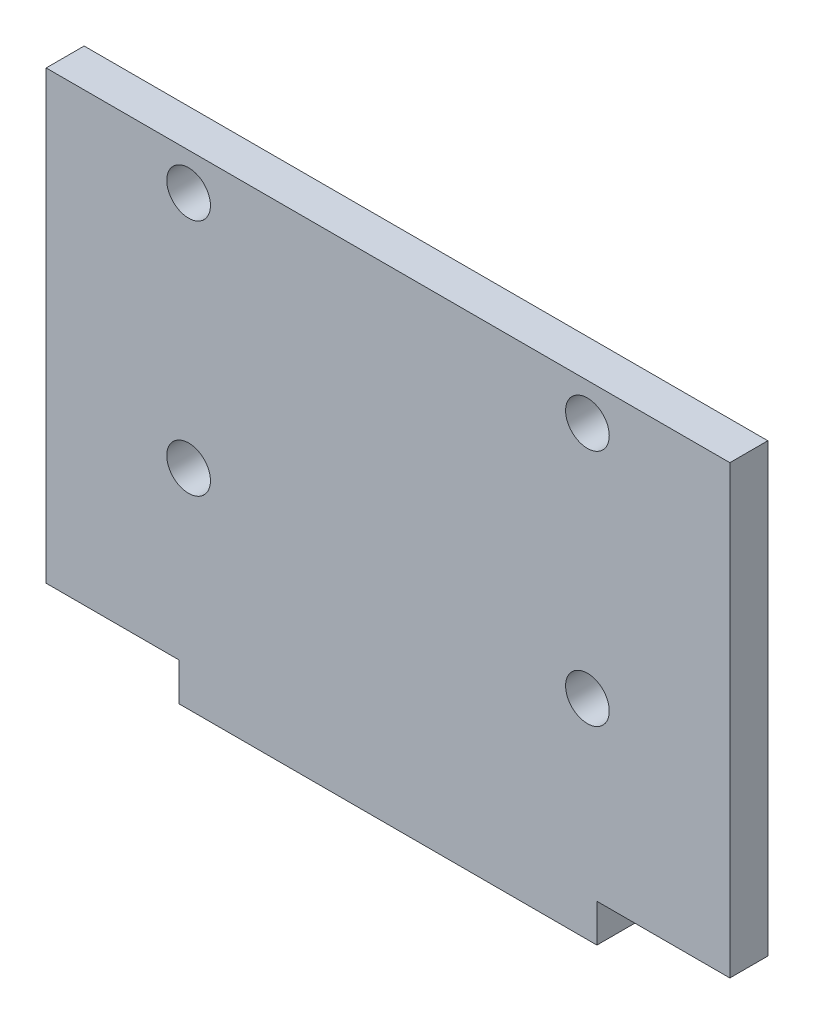
ISO-10303-21;
HEADER;
FILE_DESCRIPTION(('STEP AP214'),'2;1');
FILE_NAME('part.step','',(''),(''),'','','');
FILE_SCHEMA(('AUTOMOTIVE_DESIGN { 1 0 10303 214 1 1 1 1 }'));
ENDSEC;
DATA;
#1=APPLICATION_CONTEXT('core data for automotive mechanical design processes');
#2=APPLICATION_PROTOCOL_DEFINITION('international standard','automotive_design',2000,#1);
#3=PRODUCT_CONTEXT('',#1,'mechanical');
#4=PRODUCT('Part','Part','',(#3));
#5=PRODUCT_RELATED_PRODUCT_CATEGORY('part','',(#4));
#6=PRODUCT_DEFINITION_FORMATION('','',#4);
#7=PRODUCT_DEFINITION_CONTEXT('part definition',#1,'design');
#8=PRODUCT_DEFINITION('design','',#6,#7);
#9=PRODUCT_DEFINITION_SHAPE('','',#8);
#10=(LENGTH_UNIT() NAMED_UNIT(*) SI_UNIT(.MILLI.,.METRE.));
#11=(NAMED_UNIT(*) PLANE_ANGLE_UNIT() SI_UNIT($,.RADIAN.));
#12=(NAMED_UNIT(*) SI_UNIT($,.STERADIAN.) SOLID_ANGLE_UNIT());
#13=UNCERTAINTY_MEASURE_WITH_UNIT(LENGTH_MEASURE(1.E-05),#10,'distance_accuracy_value','');
#14=(GEOMETRIC_REPRESENTATION_CONTEXT(3) GLOBAL_UNCERTAINTY_ASSIGNED_CONTEXT((#13)) GLOBAL_UNIT_ASSIGNED_CONTEXT((#10,
#11,#12)) REPRESENTATION_CONTEXT('',''));
#15=CARTESIAN_POINT('',(0.,0.,0.));
#16=DIRECTION('',(0.,0.,1.));
#17=DIRECTION('',(1.,0.,0.));
#18=AXIS2_PLACEMENT_3D('',#15,#16,#17);
#19=CARTESIAN_POINT('',(0.,0.,2.));
#20=DIRECTION('',(0.,0.,-1.));
#21=DIRECTION('',(-1.,0.,0.));
#22=AXIS2_PLACEMENT_3D('',#19,#20,#21);
#23=PLANE('',#22);
#24=DIRECTION('',(1.,0.,0.));
#25=VECTOR('',#24,1.);
#26=CARTESIAN_POINT('',(0.,2.,2.));
#27=LINE('',#26,#25);
#28=CARTESIAN_POINT('',(-7.,2.,2.));
#29=VERTEX_POINT('',#28);
#30=CARTESIAN_POINT('',(0.,2.,2.));
#31=VERTEX_POINT('',#30);
#32=EDGE_CURVE('E164',#29,#31,#27,.T.);
#33=ORIENTED_EDGE('',*,*,#32,.T.);
#34=DIRECTION('',(0.,-1.,0.));
#35=VECTOR('',#34,1.);
#36=CARTESIAN_POINT('',(0.,0.,2.));
#37=LINE('',#36,#35);
#38=CARTESIAN_POINT('',(0.,0.,2.));
#39=VERTEX_POINT('',#38);
#40=EDGE_CURVE('E100',#31,#39,#37,.T.);
#41=ORIENTED_EDGE('',*,*,#40,.T.);
#42=DIRECTION('',(1.,0.,0.));
#43=VECTOR('',#42,1.);
#44=CARTESIAN_POINT('',(22.,0.,2.));
#45=LINE('',#44,#43);
#46=CARTESIAN_POINT('',(22.,0.,2.));
#47=VERTEX_POINT('',#46);
#48=EDGE_CURVE('E185',#39,#47,#45,.T.);
#49=ORIENTED_EDGE('',*,*,#48,.T.);
#50=DIRECTION('',(0.,1.,0.));
#51=VECTOR('',#50,1.);
#52=CARTESIAN_POINT('',(22.,2.,2.));
#53=LINE('',#52,#51);
#54=CARTESIAN_POINT('',(22.,2.,2.));
#55=VERTEX_POINT('',#54);
#56=EDGE_CURVE('E199',#47,#55,#53,.T.);
#57=ORIENTED_EDGE('',*,*,#56,.T.);
#58=DIRECTION('',(1.,0.,0.));
#59=VECTOR('',#58,1.);
#60=CARTESIAN_POINT('',(29.,2.,2.));
#61=LINE('',#60,#59);
#62=CARTESIAN_POINT('',(29.,2.,2.));
#63=VERTEX_POINT('',#62);
#64=EDGE_CURVE('E119',#55,#63,#61,.T.);
#65=ORIENTED_EDGE('',*,*,#64,.T.);
#66=DIRECTION('',(0.,1.,0.));
#67=VECTOR('',#66,1.);
#68=CARTESIAN_POINT('',(29.,25.5,2.));
#69=LINE('',#68,#67);
#70=CARTESIAN_POINT('',(29.,25.5,2.));
#71=VERTEX_POINT('',#70);
#72=EDGE_CURVE('E113',#63,#71,#69,.T.);
#73=ORIENTED_EDGE('',*,*,#72,.T.);
#74=DIRECTION('',(-1.,0.,0.));
#75=VECTOR('',#74,1.);
#76=CARTESIAN_POINT('',(-7.,25.5,2.));
#77=LINE('',#76,#75);
#78=CARTESIAN_POINT('',(-7.,25.5,2.));
#79=VERTEX_POINT('',#78);
#80=EDGE_CURVE('E117',#71,#79,#77,.T.);
#81=ORIENTED_EDGE('',*,*,#80,.T.);
#82=DIRECTION('',(0.,-1.,0.));
#83=VECTOR('',#82,1.);
#84=CARTESIAN_POINT('',(-7.,2.,2.));
#85=LINE('',#84,#83);
#86=EDGE_CURVE('E57',#79,#29,#85,.T.);
#87=ORIENTED_EDGE('',*,*,#86,.T.);
#88=EDGE_LOOP('',(#33,#41,#49,#57,#65,#73,#81,#87));
#89=FACE_BOUND('',#88,.T.);
#90=CARTESIAN_POINT('',(0.5,11.,2.));
#91=DIRECTION('',(0.,0.,1.));
#92=DIRECTION('',(1.,0.,0.));
#93=AXIS2_PLACEMENT_3D('',#90,#91,#92);
#94=CIRCLE('',#93,1.15);
#95=CARTESIAN_POINT('',(1.65,11.,2.));
#96=VERTEX_POINT('',#95);
#97=EDGE_CURVE('E146',#96,#96,#94,.T.);
#98=ORIENTED_EDGE('',*,*,#97,.F.);
#99=EDGE_LOOP('',(#98));
#100=FACE_BOUND('',#99,.T.);
#101=CARTESIAN_POINT('',(0.5,23.55,2.));
#102=DIRECTION('',(0.,0.,1.));
#103=DIRECTION('',(1.,0.,0.));
#104=AXIS2_PLACEMENT_3D('',#101,#102,#103);
#105=CIRCLE('',#104,1.15);
#106=CARTESIAN_POINT('',(1.65,23.55,2.));
#107=VERTEX_POINT('',#106);
#108=EDGE_CURVE('E213',#107,#107,#105,.T.);
#109=ORIENTED_EDGE('',*,*,#108,.F.);
#110=EDGE_LOOP('',(#109));
#111=FACE_BOUND('',#110,.T.);
#112=CARTESIAN_POINT('',(21.5,23.55,2.));
#113=DIRECTION('',(0.,0.,1.));
#114=DIRECTION('',(1.,0.,0.));
#115=AXIS2_PLACEMENT_3D('',#112,#113,#114);
#116=CIRCLE('',#115,1.15);
#117=CARTESIAN_POINT('',(22.65,23.55,2.));
#118=VERTEX_POINT('',#117);
#119=EDGE_CURVE('E221',#118,#118,#116,.T.);
#120=ORIENTED_EDGE('',*,*,#119,.F.);
#121=EDGE_LOOP('',(#120));
#122=FACE_BOUND('',#121,.T.);
#123=CARTESIAN_POINT('',(21.5,11.,2.));
#124=DIRECTION('',(0.,0.,1.));
#125=DIRECTION('',(1.,0.,0.));
#126=AXIS2_PLACEMENT_3D('',#123,#124,#125);
#127=CIRCLE('',#126,1.15);
#128=CARTESIAN_POINT('',(22.65,11.,2.));
#129=VERTEX_POINT('',#128);
#130=EDGE_CURVE('E229',#129,#129,#127,.T.);
#131=ORIENTED_EDGE('',*,*,#130,.F.);
#132=EDGE_LOOP('',(#131));
#133=FACE_BOUND('',#132,.T.);
#134=ADVANCED_FACE('F39',(#89,#100,#111,#122,#133),#23,.F.);
#135=CARTESIAN_POINT('',(0.,0.,0.));
#136=DIRECTION('',(0.,0.,-1.));
#137=DIRECTION('',(-1.,0.,0.));
#138=AXIS2_PLACEMENT_3D('',#135,#136,#137);
#139=PLANE('',#138);
#140=CARTESIAN_POINT('',(21.5,23.55,0.));
#141=DIRECTION('',(0.,0.,1.));
#142=DIRECTION('',(1.,0.,0.));
#143=AXIS2_PLACEMENT_3D('',#140,#141,#142);
#144=CIRCLE('',#143,1.15);
#145=CARTESIAN_POINT('',(22.65,23.55,0.));
#146=VERTEX_POINT('',#145);
#147=EDGE_CURVE('E225',#146,#146,#144,.T.);
#148=ORIENTED_EDGE('',*,*,#147,.T.);
#149=EDGE_LOOP('',(#148));
#150=FACE_BOUND('',#149,.T.);
#151=CARTESIAN_POINT('',(0.5,11.,0.));
#152=DIRECTION('',(0.,0.,1.));
#153=DIRECTION('',(1.,0.,0.));
#154=AXIS2_PLACEMENT_3D('',#151,#152,#153);
#155=CIRCLE('',#154,1.15);
#156=CARTESIAN_POINT('',(1.65,11.,0.));
#157=VERTEX_POINT('',#156);
#158=EDGE_CURVE('E209',#157,#157,#155,.T.);
#159=ORIENTED_EDGE('',*,*,#158,.T.);
#160=EDGE_LOOP('',(#159));
#161=FACE_BOUND('',#160,.T.);
#162=DIRECTION('',(1.,0.,0.));
#163=VECTOR('',#162,1.);
#164=CARTESIAN_POINT('',(0.,2.,0.));
#165=LINE('',#164,#163);
#166=CARTESIAN_POINT('',(-7.,2.,0.));
#167=VERTEX_POINT('',#166);
#168=CARTESIAN_POINT('',(0.,2.,0.));
#169=VERTEX_POINT('',#168);
#170=EDGE_CURVE('E141',#167,#169,#165,.T.);
#171=ORIENTED_EDGE('',*,*,#170,.F.);
#172=DIRECTION('',(0.,-1.,0.));
#173=VECTOR('',#172,1.);
#174=CARTESIAN_POINT('',(-7.,2.,0.));
#175=LINE('',#174,#173);
#176=CARTESIAN_POINT('',(-7.,25.5,0.));
#177=VERTEX_POINT('',#176);
#178=EDGE_CURVE('E92',#177,#167,#175,.T.);
#179=ORIENTED_EDGE('',*,*,#178,.F.);
#180=DIRECTION('',(-1.,0.,0.));
#181=VECTOR('',#180,1.);
#182=CARTESIAN_POINT('',(-7.,25.5,0.));
#183=LINE('',#182,#181);
#184=CARTESIAN_POINT('',(29.,25.5,0.));
#185=VERTEX_POINT('',#184);
#186=EDGE_CURVE('E86',#185,#177,#183,.T.);
#187=ORIENTED_EDGE('',*,*,#186,.F.);
#188=DIRECTION('',(0.,1.,0.));
#189=VECTOR('',#188,1.);
#190=CARTESIAN_POINT('',(29.,25.5,0.));
#191=LINE('',#190,#189);
#192=CARTESIAN_POINT('',(29.,2.,0.));
#193=VERTEX_POINT('',#192);
#194=EDGE_CURVE('E128',#193,#185,#191,.T.);
#195=ORIENTED_EDGE('',*,*,#194,.F.);
#196=DIRECTION('',(1.,0.,0.));
#197=VECTOR('',#196,1.);
#198=CARTESIAN_POINT('',(29.,2.,0.));
#199=LINE('',#198,#197);
#200=CARTESIAN_POINT('',(22.,2.,0.));
#201=VERTEX_POINT('',#200);
#202=EDGE_CURVE('E155',#201,#193,#199,.T.);
#203=ORIENTED_EDGE('',*,*,#202,.F.);
#204=DIRECTION('',(0.,1.,0.));
#205=VECTOR('',#204,1.);
#206=CARTESIAN_POINT('',(22.,2.,0.));
#207=LINE('',#206,#205);
#208=CARTESIAN_POINT('',(22.,0.,0.));
#209=VERTEX_POINT('',#208);
#210=EDGE_CURVE('E152',#209,#201,#207,.T.);
#211=ORIENTED_EDGE('',*,*,#210,.F.);
#212=DIRECTION('',(1.,0.,0.));
#213=VECTOR('',#212,1.);
#214=CARTESIAN_POINT('',(22.,0.,0.));
#215=LINE('',#214,#213);
#216=CARTESIAN_POINT('',(0.,0.,0.));
#217=VERTEX_POINT('',#216);
#218=EDGE_CURVE('E149',#217,#209,#215,.T.);
#219=ORIENTED_EDGE('',*,*,#218,.F.);
#220=DIRECTION('',(0.,-1.,0.));
#221=VECTOR('',#220,1.);
#222=CARTESIAN_POINT('',(0.,0.,0.));
#223=LINE('',#222,#221);
#224=EDGE_CURVE('E145',#169,#217,#223,.T.);
#225=ORIENTED_EDGE('',*,*,#224,.F.);
#226=EDGE_LOOP('',(#171,#179,#187,#195,#203,#211,#219,#225));
#227=FACE_BOUND('',#226,.T.);
#228=CARTESIAN_POINT('',(0.5,23.55,0.));
#229=DIRECTION('',(0.,0.,1.));
#230=DIRECTION('',(1.,0.,0.));
#231=AXIS2_PLACEMENT_3D('',#228,#229,#230);
#232=CIRCLE('',#231,1.15);
#233=CARTESIAN_POINT('',(1.65,23.55,0.));
#234=VERTEX_POINT('',#233);
#235=EDGE_CURVE('E217',#234,#234,#232,.T.);
#236=ORIENTED_EDGE('',*,*,#235,.T.);
#237=EDGE_LOOP('',(#236));
#238=FACE_BOUND('',#237,.T.);
#239=CARTESIAN_POINT('',(21.5,11.,0.));
#240=DIRECTION('',(0.,0.,1.));
#241=DIRECTION('',(1.,0.,0.));
#242=AXIS2_PLACEMENT_3D('',#239,#240,#241);
#243=CIRCLE('',#242,1.15);
#244=CARTESIAN_POINT('',(22.65,11.,0.));
#245=VERTEX_POINT('',#244);
#246=EDGE_CURVE('E233',#245,#245,#243,.T.);
#247=ORIENTED_EDGE('',*,*,#246,.T.);
#248=EDGE_LOOP('',(#247));
#249=FACE_BOUND('',#248,.T.);
#250=ADVANCED_FACE('F189',(#150,#161,#227,#238,#249),#139,.T.);
#251=CARTESIAN_POINT('',(0.,2.,2.));
#252=DIRECTION('',(0.,1.,0.));
#253=DIRECTION('',(-1.,0.,0.));
#254=AXIS2_PLACEMENT_3D('',#251,#252,#253);
#255=PLANE('',#254);
#256=ORIENTED_EDGE('',*,*,#170,.T.);
#257=DIRECTION('',(0.,0.,-1.));
#258=VECTOR('',#257,1.);
#259=CARTESIAN_POINT('',(0.,2.,2.));
#260=LINE('',#259,#258);
#261=EDGE_CURVE('E11',#31,#169,#260,.T.);
#262=ORIENTED_EDGE('',*,*,#261,.F.);
#263=ORIENTED_EDGE('',*,*,#32,.F.);
#264=DIRECTION('',(0.,0.,-1.));
#265=VECTOR('',#264,1.);
#266=CARTESIAN_POINT('',(-7.,2.,2.));
#267=LINE('',#266,#265);
#268=EDGE_CURVE('E137',#29,#167,#267,.T.);
#269=ORIENTED_EDGE('',*,*,#268,.T.);
#270=EDGE_LOOP('',(#256,#262,#263,#269));
#271=FACE_BOUND('',#270,.T.);
#272=ADVANCED_FACE('F41',(#271),#255,.F.);
#273=CARTESIAN_POINT('',(0.,0.,2.));
#274=DIRECTION('',(1.,0.,0.));
#275=DIRECTION('',(0.,0.,-1.));
#276=AXIS2_PLACEMENT_3D('',#273,#274,#275);
#277=PLANE('',#276);
#278=ORIENTED_EDGE('',*,*,#224,.T.);
#279=DIRECTION('',(0.,0.,-1.));
#280=VECTOR('',#279,1.);
#281=CARTESIAN_POINT('',(0.,0.,2.));
#282=LINE('',#281,#280);
#283=EDGE_CURVE('E49',#39,#217,#282,.T.);
#284=ORIENTED_EDGE('',*,*,#283,.F.);
#285=ORIENTED_EDGE('',*,*,#40,.F.);
#286=ORIENTED_EDGE('',*,*,#261,.T.);
#287=EDGE_LOOP('',(#278,#284,#285,#286));
#288=FACE_BOUND('',#287,.T.);
#289=ADVANCED_FACE('F267',(#288),#277,.F.);
#290=CARTESIAN_POINT('',(22.,0.,2.));
#291=DIRECTION('',(0.,1.,0.));
#292=DIRECTION('',(0.,0.,1.));
#293=AXIS2_PLACEMENT_3D('',#290,#291,#292);
#294=PLANE('',#293);
#295=ORIENTED_EDGE('',*,*,#218,.T.);
#296=DIRECTION('',(0.,0.,-1.));
#297=VECTOR('',#296,1.);
#298=CARTESIAN_POINT('',(22.,0.,2.));
#299=LINE('',#298,#297);
#300=EDGE_CURVE('E175',#47,#209,#299,.T.);
#301=ORIENTED_EDGE('',*,*,#300,.F.);
#302=ORIENTED_EDGE('',*,*,#48,.F.);
#303=ORIENTED_EDGE('',*,*,#283,.T.);
#304=EDGE_LOOP('',(#295,#301,#302,#303));
#305=FACE_BOUND('',#304,.T.);
#306=ADVANCED_FACE('F183',(#305),#294,.F.);
#307=CARTESIAN_POINT('',(22.,2.,2.));
#308=DIRECTION('',(-1.,0.,0.));
#309=DIRECTION('',(0.,0.,1.));
#310=AXIS2_PLACEMENT_3D('',#307,#308,#309);
#311=PLANE('',#310);
#312=ORIENTED_EDGE('',*,*,#210,.T.);
#313=DIRECTION('',(0.,0.,-1.));
#314=VECTOR('',#313,1.);
#315=CARTESIAN_POINT('',(22.,2.,2.));
#316=LINE('',#315,#314);
#317=EDGE_CURVE('E171',#55,#201,#316,.T.);
#318=ORIENTED_EDGE('',*,*,#317,.F.);
#319=ORIENTED_EDGE('',*,*,#56,.F.);
#320=ORIENTED_EDGE('',*,*,#300,.T.);
#321=EDGE_LOOP('',(#312,#318,#319,#320));
#322=FACE_BOUND('',#321,.T.);
#323=ADVANCED_FACE('F194',(#322),#311,.F.);
#324=CARTESIAN_POINT('',(29.,2.,2.));
#325=DIRECTION('',(0.,1.,0.));
#326=DIRECTION('',(-1.,0.,0.));
#327=AXIS2_PLACEMENT_3D('',#324,#325,#326);
#328=PLANE('',#327);
#329=ORIENTED_EDGE('',*,*,#202,.T.);
#330=DIRECTION('',(0.,0.,-1.));
#331=VECTOR('',#330,1.);
#332=CARTESIAN_POINT('',(29.,2.,2.));
#333=LINE('',#332,#331);
#334=EDGE_CURVE('E130',#63,#193,#333,.T.);
#335=ORIENTED_EDGE('',*,*,#334,.F.);
#336=ORIENTED_EDGE('',*,*,#64,.F.);
#337=ORIENTED_EDGE('',*,*,#317,.T.);
#338=EDGE_LOOP('',(#329,#335,#336,#337));
#339=FACE_BOUND('',#338,.T.);
#340=ADVANCED_FACE('F197',(#339),#328,.F.);
#341=CARTESIAN_POINT('',(29.,25.5,2.));
#342=DIRECTION('',(-1.,0.,0.));
#343=DIRECTION('',(0.,0.,1.));
#344=AXIS2_PLACEMENT_3D('',#341,#342,#343);
#345=PLANE('',#344);
#346=ORIENTED_EDGE('',*,*,#194,.T.);
#347=DIRECTION('',(0.,0.,-1.));
#348=VECTOR('',#347,1.);
#349=CARTESIAN_POINT('',(29.,25.5,2.));
#350=LINE('',#349,#348);
#351=EDGE_CURVE('E125',#71,#185,#350,.T.);
#352=ORIENTED_EDGE('',*,*,#351,.F.);
#353=ORIENTED_EDGE('',*,*,#72,.F.);
#354=ORIENTED_EDGE('',*,*,#334,.T.);
#355=EDGE_LOOP('',(#346,#352,#353,#354));
#356=FACE_BOUND('',#355,.T.);
#357=ADVANCED_FACE('F126',(#356),#345,.F.);
#358=CARTESIAN_POINT('',(-7.,25.5,2.));
#359=DIRECTION('',(0.,-1.,0.));
#360=DIRECTION('',(0.,0.,-1.));
#361=AXIS2_PLACEMENT_3D('',#358,#359,#360);
#362=PLANE('',#361);
#363=ORIENTED_EDGE('',*,*,#186,.T.);
#364=DIRECTION('',(0.,0.,-1.));
#365=VECTOR('',#364,1.);
#366=CARTESIAN_POINT('',(-7.,25.5,2.));
#367=LINE('',#366,#365);
#368=EDGE_CURVE('E131',#79,#177,#367,.T.);
#369=ORIENTED_EDGE('',*,*,#368,.F.);
#370=ORIENTED_EDGE('',*,*,#80,.F.);
#371=ORIENTED_EDGE('',*,*,#351,.T.);
#372=EDGE_LOOP('',(#363,#369,#370,#371));
#373=FACE_BOUND('',#372,.T.);
#374=ADVANCED_FACE('F133',(#373),#362,.F.);
#375=CARTESIAN_POINT('',(-7.,2.,2.));
#376=DIRECTION('',(1.,0.,0.));
#377=DIRECTION('',(0.,0.,-1.));
#378=AXIS2_PLACEMENT_3D('',#375,#376,#377);
#379=PLANE('',#378);
#380=ORIENTED_EDGE('',*,*,#178,.T.);
#381=ORIENTED_EDGE('',*,*,#268,.F.);
#382=ORIENTED_EDGE('',*,*,#86,.F.);
#383=ORIENTED_EDGE('',*,*,#368,.T.);
#384=EDGE_LOOP('',(#380,#381,#382,#383));
#385=FACE_BOUND('',#384,.T.);
#386=ADVANCED_FACE('F255',(#385),#379,.F.);
#387=CARTESIAN_POINT('',(0.5,11.,2.));
#388=DIRECTION('',(0.,0.,-1.));
#389=DIRECTION('',(-1.,0.,0.));
#390=AXIS2_PLACEMENT_3D('',#387,#388,#389);
#391=CYLINDRICAL_SURFACE('',#390,1.15);
#392=ORIENTED_EDGE('',*,*,#97,.T.);
#393=EDGE_LOOP('',(#392));
#394=FACE_BOUND('',#393,.T.);
#395=ORIENTED_EDGE('',*,*,#158,.F.);
#396=EDGE_LOOP('',(#395));
#397=FACE_BOUND('',#396,.T.);
#398=ADVANCED_FACE('F252',(#394,#397),#391,.F.);
#399=CARTESIAN_POINT('',(0.5,23.55,2.));
#400=DIRECTION('',(0.,0.,-1.));
#401=DIRECTION('',(-1.,0.,0.));
#402=AXIS2_PLACEMENT_3D('',#399,#400,#401);
#403=CYLINDRICAL_SURFACE('',#402,1.15);
#404=ORIENTED_EDGE('',*,*,#108,.T.);
#405=EDGE_LOOP('',(#404));
#406=FACE_BOUND('',#405,.T.);
#407=ORIENTED_EDGE('',*,*,#235,.F.);
#408=EDGE_LOOP('',(#407));
#409=FACE_BOUND('',#408,.T.);
#410=ADVANCED_FACE('F331',(#406,#409),#403,.F.);
#411=CARTESIAN_POINT('',(21.5,23.55,2.));
#412=DIRECTION('',(0.,0.,-1.));
#413=DIRECTION('',(-1.,0.,0.));
#414=AXIS2_PLACEMENT_3D('',#411,#412,#413);
#415=CYLINDRICAL_SURFACE('',#414,1.15);
#416=ORIENTED_EDGE('',*,*,#119,.T.);
#417=EDGE_LOOP('',(#416));
#418=FACE_BOUND('',#417,.T.);
#419=ORIENTED_EDGE('',*,*,#147,.F.);
#420=EDGE_LOOP('',(#419));
#421=FACE_BOUND('',#420,.T.);
#422=ADVANCED_FACE('F339',(#418,#421),#415,.F.);
#423=CARTESIAN_POINT('',(21.5,11.,2.));
#424=DIRECTION('',(0.,0.,-1.));
#425=DIRECTION('',(-1.,0.,0.));
#426=AXIS2_PLACEMENT_3D('',#423,#424,#425);
#427=CYLINDRICAL_SURFACE('',#426,1.15);
#428=ORIENTED_EDGE('',*,*,#130,.T.);
#429=EDGE_LOOP('',(#428));
#430=FACE_BOUND('',#429,.T.);
#431=ORIENTED_EDGE('',*,*,#246,.F.);
#432=EDGE_LOOP('',(#431));
#433=FACE_BOUND('',#432,.T.);
#434=ADVANCED_FACE('F241',(#430,#433),#427,.F.);
#435=CLOSED_SHELL('',(#134,#250,#272,#289,#306,#323,#340,#357,#374,#386,#398,#410,#422,#434));
#436=MANIFOLD_SOLID_BREP('B2',#435);
#437=ADVANCED_BREP_SHAPE_REPRESENTATION('',(#18,#436),#14);
#438=SHAPE_DEFINITION_REPRESENTATION(#9,#437);
ENDSEC;
END-ISO-10303-21;
